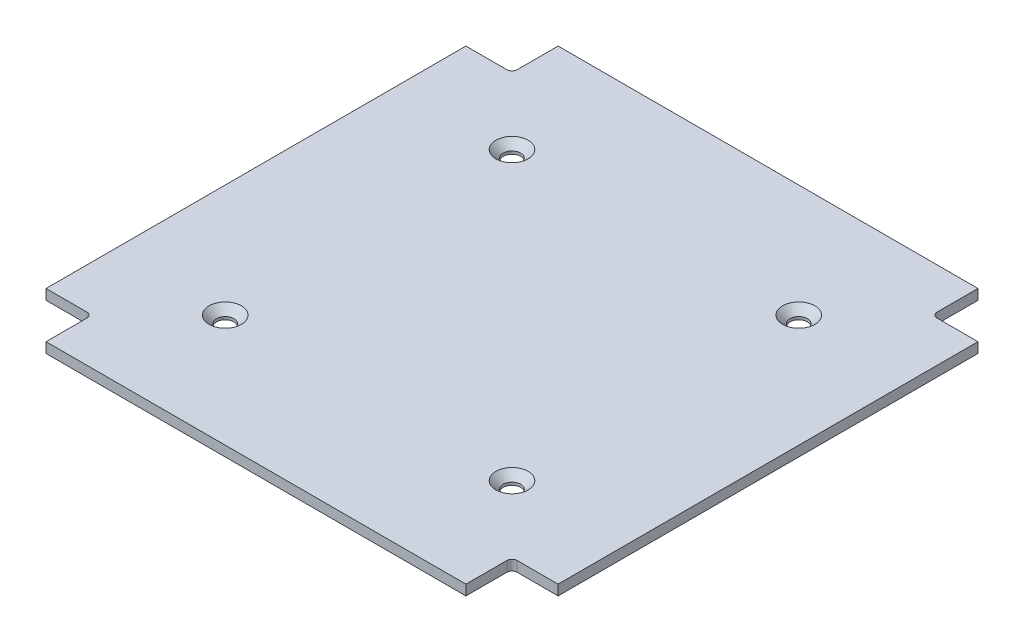
ISO-10303-21;
HEADER;
FILE_DESCRIPTION(('STEP AP214'),'2;1');
FILE_NAME('part.step','',(''),(''),'','','');
FILE_SCHEMA(('AUTOMOTIVE_DESIGN { 1 0 10303 214 1 1 1 1 }'));
ENDSEC;
DATA;
#1=APPLICATION_CONTEXT('core data for automotive mechanical design processes');
#2=APPLICATION_PROTOCOL_DEFINITION('international standard','automotive_design',2000,#1);
#3=PRODUCT_CONTEXT('',#1,'mechanical');
#4=PRODUCT('Part','Part','',(#3));
#5=PRODUCT_RELATED_PRODUCT_CATEGORY('part','',(#4));
#6=PRODUCT_DEFINITION_FORMATION('','',#4);
#7=PRODUCT_DEFINITION_CONTEXT('part definition',#1,'design');
#8=PRODUCT_DEFINITION('design','',#6,#7);
#9=PRODUCT_DEFINITION_SHAPE('','',#8);
#10=(LENGTH_UNIT() NAMED_UNIT(*) SI_UNIT(.MILLI.,.METRE.));
#11=(NAMED_UNIT(*) PLANE_ANGLE_UNIT() SI_UNIT($,.RADIAN.));
#12=(NAMED_UNIT(*) SI_UNIT($,.STERADIAN.) SOLID_ANGLE_UNIT());
#13=UNCERTAINTY_MEASURE_WITH_UNIT(LENGTH_MEASURE(1.E-05),#10,'distance_accuracy_value','');
#14=(GEOMETRIC_REPRESENTATION_CONTEXT(3) GLOBAL_UNCERTAINTY_ASSIGNED_CONTEXT((#13)) GLOBAL_UNIT_ASSIGNED_CONTEXT((#10,
#11,#12)) REPRESENTATION_CONTEXT('',''));
#15=CARTESIAN_POINT('',(0.,0.,0.));
#16=DIRECTION('',(0.,0.,1.));
#17=DIRECTION('',(1.,0.,0.));
#18=AXIS2_PLACEMENT_3D('',#15,#16,#17);
#19=CARTESIAN_POINT('',(50.,2.,50.));
#20=DIRECTION('',(-1.,0.,0.));
#21=DIRECTION('',(0.,0.,1.));
#22=AXIS2_PLACEMENT_3D('',#19,#20,#21);
#23=PLANE('',#22);
#24=DIRECTION('',(0.,0.,-1.));
#25=VECTOR('',#24,1.);
#26=CARTESIAN_POINT('',(50.,2.,50.));
#27=LINE('',#26,#25);
#28=CARTESIAN_POINT('',(50.,2.,41.));
#29=VERTEX_POINT('',#28);
#30=CARTESIAN_POINT('',(50.,2.,-41.));
#31=VERTEX_POINT('',#30);
#32=EDGE_CURVE('E159',#29,#31,#27,.T.);
#33=ORIENTED_EDGE('',*,*,#32,.F.);
#34=DIRECTION('',(0.,1.,0.));
#35=VECTOR('',#34,1.);
#36=CARTESIAN_POINT('',(50.,0.,41.));
#37=LINE('',#36,#35);
#38=CARTESIAN_POINT('',(50.,0.,41.));
#39=VERTEX_POINT('',#38);
#40=EDGE_CURVE('E145',#39,#29,#37,.T.);
#41=ORIENTED_EDGE('',*,*,#40,.F.);
#42=DIRECTION('',(0.,0.,-1.));
#43=VECTOR('',#42,1.);
#44=CARTESIAN_POINT('',(50.,0.,50.));
#45=LINE('',#44,#43);
#46=CARTESIAN_POINT('',(50.,0.,-41.));
#47=VERTEX_POINT('',#46);
#48=EDGE_CURVE('E156',#39,#47,#45,.T.);
#49=ORIENTED_EDGE('',*,*,#48,.T.);
#50=DIRECTION('',(0.,1.,0.));
#51=VECTOR('',#50,1.);
#52=CARTESIAN_POINT('',(50.,0.,-41.));
#53=LINE('',#52,#51);
#54=EDGE_CURVE('E166',#47,#31,#53,.T.);
#55=ORIENTED_EDGE('',*,*,#54,.T.);
#56=EDGE_LOOP('',(#33,#41,#49,#55));
#57=FACE_BOUND('',#56,.T.);
#58=ADVANCED_FACE('F33',(#57),#23,.F.);
#59=CARTESIAN_POINT('',(-50.,2.,-50.));
#60=DIRECTION('',(0.,0.,1.));
#61=DIRECTION('',(1.,0.,0.));
#62=AXIS2_PLACEMENT_3D('',#59,#60,#61);
#63=PLANE('',#62);
#64=DIRECTION('',(-1.,0.,0.));
#65=VECTOR('',#64,1.);
#66=CARTESIAN_POINT('',(-50.,0.,-50.));
#67=LINE('',#66,#65);
#68=CARTESIAN_POINT('',(41.,0.,-50.));
#69=VERTEX_POINT('',#68);
#70=CARTESIAN_POINT('',(-41.,0.,-50.));
#71=VERTEX_POINT('',#70);
#72=EDGE_CURVE('E165',#69,#71,#67,.T.);
#73=ORIENTED_EDGE('',*,*,#72,.T.);
#74=DIRECTION('',(0.,1.,0.));
#75=VECTOR('',#74,1.);
#76=CARTESIAN_POINT('',(-41.,0.,-50.));
#77=LINE('',#76,#75);
#78=CARTESIAN_POINT('',(-41.,2.,-50.));
#79=VERTEX_POINT('',#78);
#80=EDGE_CURVE('E261',#71,#79,#77,.T.);
#81=ORIENTED_EDGE('',*,*,#80,.T.);
#82=DIRECTION('',(-1.,0.,0.));
#83=VECTOR('',#82,1.);
#84=CARTESIAN_POINT('',(-50.,2.,-50.));
#85=LINE('',#84,#83);
#86=CARTESIAN_POINT('',(41.,2.,-50.));
#87=VERTEX_POINT('',#86);
#88=EDGE_CURVE('E276',#87,#79,#85,.T.);
#89=ORIENTED_EDGE('',*,*,#88,.F.);
#90=DIRECTION('',(0.,1.,0.));
#91=VECTOR('',#90,1.);
#92=CARTESIAN_POINT('',(41.,0.,-50.));
#93=LINE('',#92,#91);
#94=EDGE_CURVE('E171',#69,#87,#93,.T.);
#95=ORIENTED_EDGE('',*,*,#94,.F.);
#96=EDGE_LOOP('',(#73,#81,#89,#95));
#97=FACE_BOUND('',#96,.T.);
#98=ADVANCED_FACE('F358',(#97),#63,.F.);
#99=CARTESIAN_POINT('',(-50.,2.,50.));
#100=DIRECTION('',(1.,0.,0.));
#101=DIRECTION('',(0.,0.,-1.));
#102=AXIS2_PLACEMENT_3D('',#99,#100,#101);
#103=PLANE('',#102);
#104=DIRECTION('',(0.,0.,1.));
#105=VECTOR('',#104,1.);
#106=CARTESIAN_POINT('',(-50.,0.,50.));
#107=LINE('',#106,#105);
#108=CARTESIAN_POINT('',(-50.,0.,-41.));
#109=VERTEX_POINT('',#108);
#110=CARTESIAN_POINT('',(-50.,0.,41.));
#111=VERTEX_POINT('',#110);
#112=EDGE_CURVE('E169',#109,#111,#107,.T.);
#113=ORIENTED_EDGE('',*,*,#112,.T.);
#114=DIRECTION('',(0.,1.,0.));
#115=VECTOR('',#114,1.);
#116=CARTESIAN_POINT('',(-50.,0.,41.));
#117=LINE('',#116,#115);
#118=CARTESIAN_POINT('',(-50.,2.,41.));
#119=VERTEX_POINT('',#118);
#120=EDGE_CURVE('E227',#111,#119,#117,.T.);
#121=ORIENTED_EDGE('',*,*,#120,.T.);
#122=DIRECTION('',(0.,0.,1.));
#123=VECTOR('',#122,1.);
#124=CARTESIAN_POINT('',(-50.,2.,50.));
#125=LINE('',#124,#123);
#126=CARTESIAN_POINT('',(-50.,2.,-41.));
#127=VERTEX_POINT('',#126);
#128=EDGE_CURVE('E278',#127,#119,#125,.T.);
#129=ORIENTED_EDGE('',*,*,#128,.F.);
#130=DIRECTION('',(0.,1.,0.));
#131=VECTOR('',#130,1.);
#132=CARTESIAN_POINT('',(-50.,0.,-41.));
#133=LINE('',#132,#131);
#134=EDGE_CURVE('E257',#109,#127,#133,.T.);
#135=ORIENTED_EDGE('',*,*,#134,.F.);
#136=EDGE_LOOP('',(#113,#121,#129,#135));
#137=FACE_BOUND('',#136,.T.);
#138=ADVANCED_FACE('F363',(#137),#103,.F.);
#139=CARTESIAN_POINT('',(-50.,2.,50.));
#140=DIRECTION('',(0.,0.,-1.));
#141=DIRECTION('',(-1.,0.,0.));
#142=AXIS2_PLACEMENT_3D('',#139,#140,#141);
#143=PLANE('',#142);
#144=DIRECTION('',(1.,0.,0.));
#145=VECTOR('',#144,1.);
#146=CARTESIAN_POINT('',(-50.,0.,50.));
#147=LINE('',#146,#145);
#148=CARTESIAN_POINT('',(-41.,0.,50.));
#149=VERTEX_POINT('',#148);
#150=CARTESIAN_POINT('',(41.,0.,50.));
#151=VERTEX_POINT('',#150);
#152=EDGE_CURVE('E179',#149,#151,#147,.T.);
#153=ORIENTED_EDGE('',*,*,#152,.T.);
#154=DIRECTION('',(0.,1.,0.));
#155=VECTOR('',#154,1.);
#156=CARTESIAN_POINT('',(41.,0.,50.));
#157=LINE('',#156,#155);
#158=CARTESIAN_POINT('',(41.,2.,50.));
#159=VERTEX_POINT('',#158);
#160=EDGE_CURVE('E160',#151,#159,#157,.T.);
#161=ORIENTED_EDGE('',*,*,#160,.T.);
#162=DIRECTION('',(1.,0.,0.));
#163=VECTOR('',#162,1.);
#164=CARTESIAN_POINT('',(-50.,2.,50.));
#165=LINE('',#164,#163);
#166=CARTESIAN_POINT('',(-41.,2.,50.));
#167=VERTEX_POINT('',#166);
#168=EDGE_CURVE('E174',#167,#159,#165,.T.);
#169=ORIENTED_EDGE('',*,*,#168,.F.);
#170=DIRECTION('',(0.,1.,0.));
#171=VECTOR('',#170,1.);
#172=CARTESIAN_POINT('',(-41.,0.,50.));
#173=LINE('',#172,#171);
#174=EDGE_CURVE('E228',#149,#167,#173,.T.);
#175=ORIENTED_EDGE('',*,*,#174,.F.);
#176=EDGE_LOOP('',(#153,#161,#169,#175));
#177=FACE_BOUND('',#176,.T.);
#178=ADVANCED_FACE('F282',(#177),#143,.F.);
#179=CARTESIAN_POINT('',(50.,2.,-50.));
#180=DIRECTION('',(0.,-1.,0.));
#181=DIRECTION('',(0.,0.,-1.));
#182=AXIS2_PLACEMENT_3D('',#179,#180,#181);
#183=PLANE('',#182);
#184=CARTESIAN_POINT('',(-28.,2.,28.));
#185=DIRECTION('',(0.,1.,0.));
#186=DIRECTION('',(0.,0.,1.));
#187=AXIS2_PLACEMENT_3D('',#184,#185,#186);
#188=CIRCLE('',#187,3.15);
#189=CARTESIAN_POINT('',(-28.,2.,31.15));
#190=VERTEX_POINT('',#189);
#191=EDGE_CURVE('E326',#190,#190,#188,.T.);
#192=ORIENTED_EDGE('',*,*,#191,.F.);
#193=EDGE_LOOP('',(#192));
#194=FACE_BOUND('',#193,.T.);
#195=CARTESIAN_POINT('',(-28.,2.,-28.));
#196=DIRECTION('',(0.,1.,0.));
#197=DIRECTION('',(0.,0.,1.));
#198=AXIS2_PLACEMENT_3D('',#195,#196,#197);
#199=CIRCLE('',#198,3.15);
#200=CARTESIAN_POINT('',(-28.,2.,-24.85));
#201=VERTEX_POINT('',#200);
#202=EDGE_CURVE('E317',#201,#201,#199,.T.);
#203=ORIENTED_EDGE('',*,*,#202,.F.);
#204=EDGE_LOOP('',(#203));
#205=FACE_BOUND('',#204,.T.);
#206=CARTESIAN_POINT('',(28.,2.,-28.));
#207=DIRECTION('',(0.,1.,0.));
#208=DIRECTION('',(0.,0.,1.));
#209=AXIS2_PLACEMENT_3D('',#206,#207,#208);
#210=CIRCLE('',#209,3.15);
#211=CARTESIAN_POINT('',(28.,2.,-24.85));
#212=VERTEX_POINT('',#211);
#213=EDGE_CURVE('E308',#212,#212,#210,.T.);
#214=ORIENTED_EDGE('',*,*,#213,.F.);
#215=EDGE_LOOP('',(#214));
#216=FACE_BOUND('',#215,.T.);
#217=CARTESIAN_POINT('',(28.,2.,28.));
#218=DIRECTION('',(0.,1.,0.));
#219=DIRECTION('',(0.,0.,1.));
#220=AXIS2_PLACEMENT_3D('',#217,#218,#219);
#221=CIRCLE('',#220,3.15);
#222=CARTESIAN_POINT('',(28.,2.,31.15));
#223=VERTEX_POINT('',#222);
#224=EDGE_CURVE('E299',#223,#223,#221,.T.);
#225=ORIENTED_EDGE('',*,*,#224,.F.);
#226=EDGE_LOOP('',(#225));
#227=FACE_BOUND('',#226,.T.);
#228=ORIENTED_EDGE('',*,*,#168,.T.);
#229=DIRECTION('',(0.,0.,1.));
#230=VECTOR('',#229,1.);
#231=CARTESIAN_POINT('',(41.,2.,41.));
#232=LINE('',#231,#230);
#233=CARTESIAN_POINT('',(41.,2.,42.));
#234=VERTEX_POINT('',#233);
#235=EDGE_CURVE('E150',#234,#159,#232,.T.);
#236=ORIENTED_EDGE('',*,*,#235,.F.);
#237=CARTESIAN_POINT('',(42.,2.,42.));
#238=DIRECTION('',(0.,-1.,0.));
#239=DIRECTION('',(0.,0.,-1.));
#240=AXIS2_PLACEMENT_3D('',#237,#238,#239);
#241=CIRCLE('',#240,1.);
#242=CARTESIAN_POINT('',(42.,2.,41.));
#243=VERTEX_POINT('',#242);
#244=EDGE_CURVE('E41',#234,#243,#241,.T.);
#245=ORIENTED_EDGE('',*,*,#244,.T.);
#246=DIRECTION('',(-1.,0.,0.));
#247=VECTOR('',#246,1.);
#248=CARTESIAN_POINT('',(50.,2.,41.));
#249=LINE('',#248,#247);
#250=EDGE_CURVE('E288',#29,#243,#249,.T.);
#251=ORIENTED_EDGE('',*,*,#250,.F.);
#252=ORIENTED_EDGE('',*,*,#32,.T.);
#253=DIRECTION('',(1.,0.,0.));
#254=VECTOR('',#253,1.);
#255=CARTESIAN_POINT('',(50.,2.,-41.));
#256=LINE('',#255,#254);
#257=CARTESIAN_POINT('',(42.,2.,-41.));
#258=VERTEX_POINT('',#257);
#259=EDGE_CURVE('E269',#258,#31,#256,.T.);
#260=ORIENTED_EDGE('',*,*,#259,.F.);
#261=CARTESIAN_POINT('',(42.,2.,-42.));
#262=DIRECTION('',(0.,-1.,0.));
#263=DIRECTION('',(0.,0.,-1.));
#264=AXIS2_PLACEMENT_3D('',#261,#262,#263);
#265=CIRCLE('',#264,1.);
#266=CARTESIAN_POINT('',(41.,2.,-42.));
#267=VERTEX_POINT('',#266);
#268=EDGE_CURVE('E205',#258,#267,#265,.T.);
#269=ORIENTED_EDGE('',*,*,#268,.T.);
#270=DIRECTION('',(0.,0.,1.));
#271=VECTOR('',#270,1.);
#272=CARTESIAN_POINT('',(41.,2.,-41.));
#273=LINE('',#272,#271);
#274=EDGE_CURVE('E264',#87,#267,#273,.T.);
#275=ORIENTED_EDGE('',*,*,#274,.F.);
#276=ORIENTED_EDGE('',*,*,#88,.T.);
#277=DIRECTION('',(0.,0.,-1.));
#278=VECTOR('',#277,1.);
#279=CARTESIAN_POINT('',(-41.,2.,-41.));
#280=LINE('',#279,#278);
#281=CARTESIAN_POINT('',(-41.,2.,-42.));
#282=VERTEX_POINT('',#281);
#283=EDGE_CURVE('E255',#282,#79,#280,.T.);
#284=ORIENTED_EDGE('',*,*,#283,.F.);
#285=CARTESIAN_POINT('',(-42.,2.,-42.));
#286=DIRECTION('',(0.,-1.,0.));
#287=DIRECTION('',(0.,0.,-1.));
#288=AXIS2_PLACEMENT_3D('',#285,#286,#287);
#289=CIRCLE('',#288,1.);
#290=CARTESIAN_POINT('',(-42.,2.,-41.));
#291=VERTEX_POINT('',#290);
#292=EDGE_CURVE('E201',#282,#291,#289,.T.);
#293=ORIENTED_EDGE('',*,*,#292,.T.);
#294=DIRECTION('',(1.,0.,0.));
#295=VECTOR('',#294,1.);
#296=CARTESIAN_POINT('',(-50.,2.,-41.));
#297=LINE('',#296,#295);
#298=EDGE_CURVE('E249',#127,#291,#297,.T.);
#299=ORIENTED_EDGE('',*,*,#298,.F.);
#300=ORIENTED_EDGE('',*,*,#128,.T.);
#301=DIRECTION('',(-1.,0.,0.));
#302=VECTOR('',#301,1.);
#303=CARTESIAN_POINT('',(-50.,2.,41.));
#304=LINE('',#303,#302);
#305=CARTESIAN_POINT('',(-42.,2.,41.));
#306=VERTEX_POINT('',#305);
#307=EDGE_CURVE('E238',#306,#119,#304,.T.);
#308=ORIENTED_EDGE('',*,*,#307,.F.);
#309=CARTESIAN_POINT('',(-42.,2.,42.));
#310=DIRECTION('',(0.,-1.,0.));
#311=DIRECTION('',(0.,0.,-1.));
#312=AXIS2_PLACEMENT_3D('',#309,#310,#311);
#313=CIRCLE('',#312,1.);
#314=CARTESIAN_POINT('',(-41.,2.,42.));
#315=VERTEX_POINT('',#314);
#316=EDGE_CURVE('E209',#306,#315,#313,.T.);
#317=ORIENTED_EDGE('',*,*,#316,.T.);
#318=DIRECTION('',(0.,0.,-1.));
#319=VECTOR('',#318,1.);
#320=CARTESIAN_POINT('',(-41.,2.,41.));
#321=LINE('',#320,#319);
#322=EDGE_CURVE('E235',#167,#315,#321,.T.);
#323=ORIENTED_EDGE('',*,*,#322,.F.);
#324=EDGE_LOOP('',(#228,#236,#245,#251,#252,#260,#269,#275,#276,#284,#293,#299,#300,#308,#317,#323));
#325=FACE_BOUND('',#324,.T.);
#326=ADVANCED_FACE('F234',(#194,#205,#216,#227,#325),#183,.F.);
#327=CARTESIAN_POINT('',(50.,0.,-50.));
#328=DIRECTION('',(0.,-1.,0.));
#329=DIRECTION('',(0.,0.,-1.));
#330=AXIS2_PLACEMENT_3D('',#327,#328,#329);
#331=PLANE('',#330);
#332=CARTESIAN_POINT('',(-28.,0.,28.));
#333=DIRECTION('',(0.,1.,0.));
#334=DIRECTION('',(0.,0.,1.));
#335=AXIS2_PLACEMENT_3D('',#332,#333,#334);
#336=CIRCLE('',#335,1.7);
#337=CARTESIAN_POINT('',(-28.,0.,29.7));
#338=VERTEX_POINT('',#337);
#339=EDGE_CURVE('E320',#338,#338,#336,.T.);
#340=ORIENTED_EDGE('',*,*,#339,.T.);
#341=EDGE_LOOP('',(#340));
#342=FACE_BOUND('',#341,.T.);
#343=CARTESIAN_POINT('',(-28.,0.,-28.));
#344=DIRECTION('',(0.,1.,0.));
#345=DIRECTION('',(0.,0.,1.));
#346=AXIS2_PLACEMENT_3D('',#343,#344,#345);
#347=CIRCLE('',#346,1.7);
#348=CARTESIAN_POINT('',(-28.,0.,-26.3));
#349=VERTEX_POINT('',#348);
#350=EDGE_CURVE('E311',#349,#349,#347,.T.);
#351=ORIENTED_EDGE('',*,*,#350,.T.);
#352=EDGE_LOOP('',(#351));
#353=FACE_BOUND('',#352,.T.);
#354=CARTESIAN_POINT('',(28.,0.,-28.));
#355=DIRECTION('',(0.,1.,0.));
#356=DIRECTION('',(0.,0.,1.));
#357=AXIS2_PLACEMENT_3D('',#354,#355,#356);
#358=CIRCLE('',#357,1.7);
#359=CARTESIAN_POINT('',(28.,0.,-26.3));
#360=VERTEX_POINT('',#359);
#361=EDGE_CURVE('E302',#360,#360,#358,.T.);
#362=ORIENTED_EDGE('',*,*,#361,.T.);
#363=EDGE_LOOP('',(#362));
#364=FACE_BOUND('',#363,.T.);
#365=CARTESIAN_POINT('',(28.,0.,28.));
#366=DIRECTION('',(0.,1.,0.));
#367=DIRECTION('',(0.,0.,1.));
#368=AXIS2_PLACEMENT_3D('',#365,#366,#367);
#369=CIRCLE('',#368,1.7);
#370=CARTESIAN_POINT('',(28.,0.,29.7));
#371=VERTEX_POINT('',#370);
#372=EDGE_CURVE('E290',#371,#371,#369,.T.);
#373=ORIENTED_EDGE('',*,*,#372,.T.);
#374=EDGE_LOOP('',(#373));
#375=FACE_BOUND('',#374,.T.);
#376=DIRECTION('',(-1.,0.,0.));
#377=VECTOR('',#376,1.);
#378=CARTESIAN_POINT('',(50.,0.,41.));
#379=LINE('',#378,#377);
#380=CARTESIAN_POINT('',(42.,0.,41.));
#381=VERTEX_POINT('',#380);
#382=EDGE_CURVE('E142',#39,#381,#379,.T.);
#383=ORIENTED_EDGE('',*,*,#382,.T.);
#384=CARTESIAN_POINT('',(42.,0.,42.));
#385=DIRECTION('',(0.,-1.,0.));
#386=DIRECTION('',(0.,0.,-1.));
#387=AXIS2_PLACEMENT_3D('',#384,#385,#386);
#388=CIRCLE('',#387,1.);
#389=CARTESIAN_POINT('',(41.,0.,42.));
#390=VERTEX_POINT('',#389);
#391=EDGE_CURVE('E11',#381,#390,#388,.F.);
#392=ORIENTED_EDGE('',*,*,#391,.T.);
#393=DIRECTION('',(0.,0.,1.));
#394=VECTOR('',#393,1.);
#395=CARTESIAN_POINT('',(41.,0.,41.));
#396=LINE('',#395,#394);
#397=EDGE_CURVE('E149',#390,#151,#396,.T.);
#398=ORIENTED_EDGE('',*,*,#397,.T.);
#399=ORIENTED_EDGE('',*,*,#152,.F.);
#400=DIRECTION('',(0.,0.,-1.));
#401=VECTOR('',#400,1.);
#402=CARTESIAN_POINT('',(-41.,0.,41.));
#403=LINE('',#402,#401);
#404=CARTESIAN_POINT('',(-41.,0.,42.));
#405=VERTEX_POINT('',#404);
#406=EDGE_CURVE('E219',#149,#405,#403,.T.);
#407=ORIENTED_EDGE('',*,*,#406,.T.);
#408=CARTESIAN_POINT('',(-42.,0.,42.));
#409=DIRECTION('',(0.,-1.,0.));
#410=DIRECTION('',(0.,0.,-1.));
#411=AXIS2_PLACEMENT_3D('',#408,#409,#410);
#412=CIRCLE('',#411,1.);
#413=CARTESIAN_POINT('',(-42.,0.,41.));
#414=VERTEX_POINT('',#413);
#415=EDGE_CURVE('E211',#405,#414,#412,.F.);
#416=ORIENTED_EDGE('',*,*,#415,.T.);
#417=DIRECTION('',(-1.,0.,0.));
#418=VECTOR('',#417,1.);
#419=CARTESIAN_POINT('',(-50.,0.,41.));
#420=LINE('',#419,#418);
#421=EDGE_CURVE('E216',#414,#111,#420,.T.);
#422=ORIENTED_EDGE('',*,*,#421,.T.);
#423=ORIENTED_EDGE('',*,*,#112,.F.);
#424=DIRECTION('',(1.,0.,0.));
#425=VECTOR('',#424,1.);
#426=CARTESIAN_POINT('',(-50.,0.,-41.));
#427=LINE('',#426,#425);
#428=CARTESIAN_POINT('',(-42.,0.,-41.));
#429=VERTEX_POINT('',#428);
#430=EDGE_CURVE('E251',#109,#429,#427,.T.);
#431=ORIENTED_EDGE('',*,*,#430,.T.);
#432=CARTESIAN_POINT('',(-42.,0.,-42.));
#433=DIRECTION('',(0.,-1.,0.));
#434=DIRECTION('',(0.,0.,-1.));
#435=AXIS2_PLACEMENT_3D('',#432,#433,#434);
#436=CIRCLE('',#435,1.);
#437=CARTESIAN_POINT('',(-41.,0.,-42.));
#438=VERTEX_POINT('',#437);
#439=EDGE_CURVE('E203',#429,#438,#436,.F.);
#440=ORIENTED_EDGE('',*,*,#439,.T.);
#441=DIRECTION('',(0.,0.,-1.));
#442=VECTOR('',#441,1.);
#443=CARTESIAN_POINT('',(-41.,0.,-41.));
#444=LINE('',#443,#442);
#445=EDGE_CURVE('E254',#438,#71,#444,.T.);
#446=ORIENTED_EDGE('',*,*,#445,.T.);
#447=ORIENTED_EDGE('',*,*,#72,.F.);
#448=DIRECTION('',(0.,0.,1.));
#449=VECTOR('',#448,1.);
#450=CARTESIAN_POINT('',(41.,0.,-41.));
#451=LINE('',#450,#449);
#452=CARTESIAN_POINT('',(41.,0.,-42.));
#453=VERTEX_POINT('',#452);
#454=EDGE_CURVE('E266',#69,#453,#451,.T.);
#455=ORIENTED_EDGE('',*,*,#454,.T.);
#456=CARTESIAN_POINT('',(42.,0.,-42.));
#457=DIRECTION('',(0.,-1.,0.));
#458=DIRECTION('',(0.,0.,-1.));
#459=AXIS2_PLACEMENT_3D('',#456,#457,#458);
#460=CIRCLE('',#459,1.);
#461=CARTESIAN_POINT('',(42.,0.,-41.));
#462=VERTEX_POINT('',#461);
#463=EDGE_CURVE('E207',#453,#462,#460,.F.);
#464=ORIENTED_EDGE('',*,*,#463,.T.);
#465=DIRECTION('',(1.,0.,0.));
#466=VECTOR('',#465,1.);
#467=CARTESIAN_POINT('',(50.,0.,-41.));
#468=LINE('',#467,#466);
#469=EDGE_CURVE('E164',#462,#47,#468,.T.);
#470=ORIENTED_EDGE('',*,*,#469,.T.);
#471=ORIENTED_EDGE('',*,*,#48,.F.);
#472=EDGE_LOOP('',(#383,#392,#398,#399,#407,#416,#422,#423,#431,#440,#446,#447,#455,#464,#470,#471));
#473=FACE_BOUND('',#472,.T.);
#474=ADVANCED_FACE('F162',(#342,#353,#364,#375,#473),#331,.T.);
#475=CARTESIAN_POINT('',(50.,0.,-41.));
#476=DIRECTION('',(0.,0.,1.));
#477=DIRECTION('',(1.,0.,0.));
#478=AXIS2_PLACEMENT_3D('',#475,#476,#477);
#479=PLANE('',#478);
#480=ORIENTED_EDGE('',*,*,#469,.F.);
#481=DIRECTION('',(0.,1.,0.));
#482=VECTOR('',#481,1.);
#483=CARTESIAN_POINT('',(42.,2.,-41.));
#484=LINE('',#483,#482);
#485=EDGE_CURVE('E187',#462,#258,#484,.T.);
#486=ORIENTED_EDGE('',*,*,#485,.T.);
#487=ORIENTED_EDGE('',*,*,#259,.T.);
#488=ORIENTED_EDGE('',*,*,#54,.F.);
#489=EDGE_LOOP('',(#480,#486,#487,#488));
#490=FACE_BOUND('',#489,.T.);
#491=ADVANCED_FACE('F463',(#490),#479,.F.);
#492=CARTESIAN_POINT('',(41.,0.,-41.));
#493=DIRECTION('',(-1.,0.,0.));
#494=DIRECTION('',(0.,0.,1.));
#495=AXIS2_PLACEMENT_3D('',#492,#493,#494);
#496=PLANE('',#495);
#497=ORIENTED_EDGE('',*,*,#274,.T.);
#498=DIRECTION('',(0.,1.,0.));
#499=VECTOR('',#498,1.);
#500=CARTESIAN_POINT('',(41.,0.,-42.));
#501=LINE('',#500,#499);
#502=EDGE_CURVE('E190',#267,#453,#501,.F.);
#503=ORIENTED_EDGE('',*,*,#502,.T.);
#504=ORIENTED_EDGE('',*,*,#454,.F.);
#505=ORIENTED_EDGE('',*,*,#94,.T.);
#506=EDGE_LOOP('',(#497,#503,#504,#505));
#507=FACE_BOUND('',#506,.T.);
#508=ADVANCED_FACE('F453',(#507),#496,.F.);
#509=CARTESIAN_POINT('',(-41.,0.,-41.));
#510=DIRECTION('',(1.,0.,0.));
#511=DIRECTION('',(0.,0.,-1.));
#512=AXIS2_PLACEMENT_3D('',#509,#510,#511);
#513=PLANE('',#512);
#514=ORIENTED_EDGE('',*,*,#445,.F.);
#515=DIRECTION('',(0.,1.,0.));
#516=VECTOR('',#515,1.);
#517=CARTESIAN_POINT('',(-41.,2.,-42.));
#518=LINE('',#517,#516);
#519=EDGE_CURVE('E182',#438,#282,#518,.T.);
#520=ORIENTED_EDGE('',*,*,#519,.T.);
#521=ORIENTED_EDGE('',*,*,#283,.T.);
#522=ORIENTED_EDGE('',*,*,#80,.F.);
#523=EDGE_LOOP('',(#514,#520,#521,#522));
#524=FACE_BOUND('',#523,.T.);
#525=ADVANCED_FACE('F443',(#524),#513,.F.);
#526=CARTESIAN_POINT('',(-50.,0.,-41.));
#527=DIRECTION('',(0.,0.,1.));
#528=DIRECTION('',(1.,0.,0.));
#529=AXIS2_PLACEMENT_3D('',#526,#527,#528);
#530=PLANE('',#529);
#531=ORIENTED_EDGE('',*,*,#298,.T.);
#532=DIRECTION('',(0.,1.,0.));
#533=VECTOR('',#532,1.);
#534=CARTESIAN_POINT('',(-42.,0.,-41.));
#535=LINE('',#534,#533);
#536=EDGE_CURVE('E185',#291,#429,#535,.F.);
#537=ORIENTED_EDGE('',*,*,#536,.T.);
#538=ORIENTED_EDGE('',*,*,#430,.F.);
#539=ORIENTED_EDGE('',*,*,#134,.T.);
#540=EDGE_LOOP('',(#531,#537,#538,#539));
#541=FACE_BOUND('',#540,.T.);
#542=ADVANCED_FACE('F434',(#541),#530,.F.);
#543=CARTESIAN_POINT('',(-50.,0.,41.));
#544=DIRECTION('',(0.,0.,-1.));
#545=DIRECTION('',(-1.,0.,0.));
#546=AXIS2_PLACEMENT_3D('',#543,#544,#545);
#547=PLANE('',#546);
#548=ORIENTED_EDGE('',*,*,#421,.F.);
#549=DIRECTION('',(0.,1.,0.));
#550=VECTOR('',#549,1.);
#551=CARTESIAN_POINT('',(-42.,2.,41.));
#552=LINE('',#551,#550);
#553=EDGE_CURVE('E192',#414,#306,#552,.T.);
#554=ORIENTED_EDGE('',*,*,#553,.T.);
#555=ORIENTED_EDGE('',*,*,#307,.T.);
#556=ORIENTED_EDGE('',*,*,#120,.F.);
#557=EDGE_LOOP('',(#548,#554,#555,#556));
#558=FACE_BOUND('',#557,.T.);
#559=ADVANCED_FACE('F224',(#558),#547,.F.);
#560=CARTESIAN_POINT('',(-41.,0.,41.));
#561=DIRECTION('',(1.,0.,0.));
#562=DIRECTION('',(0.,0.,-1.));
#563=AXIS2_PLACEMENT_3D('',#560,#561,#562);
#564=PLANE('',#563);
#565=ORIENTED_EDGE('',*,*,#322,.T.);
#566=DIRECTION('',(0.,1.,0.));
#567=VECTOR('',#566,1.);
#568=CARTESIAN_POINT('',(-41.,0.,42.));
#569=LINE('',#568,#567);
#570=EDGE_CURVE('E195',#315,#405,#569,.F.);
#571=ORIENTED_EDGE('',*,*,#570,.T.);
#572=ORIENTED_EDGE('',*,*,#406,.F.);
#573=ORIENTED_EDGE('',*,*,#174,.T.);
#574=EDGE_LOOP('',(#565,#571,#572,#573));
#575=FACE_BOUND('',#574,.T.);
#576=ADVANCED_FACE('F240',(#575),#564,.F.);
#577=CARTESIAN_POINT('',(41.,0.,41.));
#578=DIRECTION('',(-1.,0.,0.));
#579=DIRECTION('',(0.,0.,1.));
#580=AXIS2_PLACEMENT_3D('',#577,#578,#579);
#581=PLANE('',#580);
#582=ORIENTED_EDGE('',*,*,#397,.F.);
#583=DIRECTION('',(0.,1.,0.));
#584=VECTOR('',#583,1.);
#585=CARTESIAN_POINT('',(41.,2.,42.));
#586=LINE('',#585,#584);
#587=EDGE_CURVE('E197',#390,#234,#586,.T.);
#588=ORIENTED_EDGE('',*,*,#587,.T.);
#589=ORIENTED_EDGE('',*,*,#235,.T.);
#590=ORIENTED_EDGE('',*,*,#160,.F.);
#591=EDGE_LOOP('',(#582,#588,#589,#590));
#592=FACE_BOUND('',#591,.T.);
#593=ADVANCED_FACE('F286',(#592),#581,.F.);
#594=CARTESIAN_POINT('',(50.,0.,41.));
#595=DIRECTION('',(0.,0.,-1.));
#596=DIRECTION('',(-1.,0.,0.));
#597=AXIS2_PLACEMENT_3D('',#594,#595,#596);
#598=PLANE('',#597);
#599=ORIENTED_EDGE('',*,*,#250,.T.);
#600=DIRECTION('',(0.,1.,0.));
#601=VECTOR('',#600,1.);
#602=CARTESIAN_POINT('',(42.,0.,41.));
#603=LINE('',#602,#601);
#604=EDGE_CURVE('E48',#243,#381,#603,.F.);
#605=ORIENTED_EDGE('',*,*,#604,.T.);
#606=ORIENTED_EDGE('',*,*,#382,.F.);
#607=ORIENTED_EDGE('',*,*,#40,.T.);
#608=EDGE_LOOP('',(#599,#605,#606,#607));
#609=FACE_BOUND('',#608,.T.);
#610=ADVANCED_FACE('F144',(#609),#598,.F.);
#611=CARTESIAN_POINT('',(28.,2.,28.));
#612=DIRECTION('',(0.,1.,0.));
#613=DIRECTION('',(0.,0.,1.));
#614=AXIS2_PLACEMENT_3D('',#611,#612,#613);
#615=CYLINDRICAL_SURFACE('',#614,1.7);
#616=ORIENTED_EDGE('',*,*,#372,.F.);
#617=EDGE_LOOP('',(#616));
#618=FACE_BOUND('',#617,.T.);
#619=CARTESIAN_POINT('',(28.,0.549999999999998,28.));
#620=DIRECTION('',(0.,1.,0.));
#621=DIRECTION('',(0.,0.,1.));
#622=AXIS2_PLACEMENT_3D('',#619,#620,#621);
#623=CIRCLE('',#622,1.7);
#624=CARTESIAN_POINT('',(28.,0.549999999999998,29.7));
#625=VERTEX_POINT('',#624);
#626=EDGE_CURVE('E296',#625,#625,#623,.T.);
#627=ORIENTED_EDGE('',*,*,#626,.T.);
#628=EDGE_LOOP('',(#627));
#629=FACE_BOUND('',#628,.T.);
#630=ADVANCED_FACE('F344',(#618,#629),#615,.F.);
#631=CARTESIAN_POINT('',(28.,2.,28.));
#632=DIRECTION('',(0.,1.,0.));
#633=DIRECTION('',(0.,0.,1.));
#634=AXIS2_PLACEMENT_3D('',#631,#632,#633);
#635=CONICAL_SURFACE('',#634,3.15,0.785398163397447);
#636=ORIENTED_EDGE('',*,*,#626,.F.);
#637=EDGE_LOOP('',(#636));
#638=FACE_BOUND('',#637,.T.);
#639=ORIENTED_EDGE('',*,*,#224,.T.);
#640=EDGE_LOOP('',(#639));
#641=FACE_BOUND('',#640,.T.);
#642=ADVANCED_FACE('F341',(#638,#641),#635,.F.);
#643=CARTESIAN_POINT('',(28.,2.,-28.));
#644=DIRECTION('',(0.,1.,0.));
#645=DIRECTION('',(0.,0.,1.));
#646=AXIS2_PLACEMENT_3D('',#643,#644,#645);
#647=CYLINDRICAL_SURFACE('',#646,1.7);
#648=ORIENTED_EDGE('',*,*,#361,.F.);
#649=EDGE_LOOP('',(#648));
#650=FACE_BOUND('',#649,.T.);
#651=CARTESIAN_POINT('',(28.,0.549999999999998,-28.));
#652=DIRECTION('',(0.,1.,0.));
#653=DIRECTION('',(0.,0.,1.));
#654=AXIS2_PLACEMENT_3D('',#651,#652,#653);
#655=CIRCLE('',#654,1.7);
#656=CARTESIAN_POINT('',(28.,0.549999999999998,-26.3));
#657=VERTEX_POINT('',#656);
#658=EDGE_CURVE('E305',#657,#657,#655,.T.);
#659=ORIENTED_EDGE('',*,*,#658,.T.);
#660=EDGE_LOOP('',(#659));
#661=FACE_BOUND('',#660,.T.);
#662=ADVANCED_FACE('F343',(#650,#661),#647,.F.);
#663=CARTESIAN_POINT('',(28.,2.,-28.));
#664=DIRECTION('',(0.,1.,0.));
#665=DIRECTION('',(0.,0.,1.));
#666=AXIS2_PLACEMENT_3D('',#663,#664,#665);
#667=CONICAL_SURFACE('',#666,3.15,0.785398163397447);
#668=ORIENTED_EDGE('',*,*,#658,.F.);
#669=EDGE_LOOP('',(#668));
#670=FACE_BOUND('',#669,.T.);
#671=ORIENTED_EDGE('',*,*,#213,.T.);
#672=EDGE_LOOP('',(#671));
#673=FACE_BOUND('',#672,.T.);
#674=ADVANCED_FACE('F351',(#670,#673),#667,.F.);
#675=CARTESIAN_POINT('',(-28.,2.,-28.));
#676=DIRECTION('',(0.,1.,0.));
#677=DIRECTION('',(0.,0.,1.));
#678=AXIS2_PLACEMENT_3D('',#675,#676,#677);
#679=CYLINDRICAL_SURFACE('',#678,1.7);
#680=ORIENTED_EDGE('',*,*,#350,.F.);
#681=EDGE_LOOP('',(#680));
#682=FACE_BOUND('',#681,.T.);
#683=CARTESIAN_POINT('',(-28.,0.549999999999998,-28.));
#684=DIRECTION('',(0.,1.,0.));
#685=DIRECTION('',(0.,0.,1.));
#686=AXIS2_PLACEMENT_3D('',#683,#684,#685);
#687=CIRCLE('',#686,1.7);
#688=CARTESIAN_POINT('',(-28.,0.549999999999998,-26.3));
#689=VERTEX_POINT('',#688);
#690=EDGE_CURVE('E314',#689,#689,#687,.T.);
#691=ORIENTED_EDGE('',*,*,#690,.T.);
#692=EDGE_LOOP('',(#691));
#693=FACE_BOUND('',#692,.T.);
#694=ADVANCED_FACE('F517',(#682,#693),#679,.F.);
#695=CARTESIAN_POINT('',(-28.,2.,-28.));
#696=DIRECTION('',(0.,1.,0.));
#697=DIRECTION('',(0.,0.,1.));
#698=AXIS2_PLACEMENT_3D('',#695,#696,#697);
#699=CONICAL_SURFACE('',#698,3.15,0.785398163397447);
#700=ORIENTED_EDGE('',*,*,#690,.F.);
#701=EDGE_LOOP('',(#700));
#702=FACE_BOUND('',#701,.T.);
#703=ORIENTED_EDGE('',*,*,#202,.T.);
#704=EDGE_LOOP('',(#703));
#705=FACE_BOUND('',#704,.T.);
#706=ADVANCED_FACE('F507',(#702,#705),#699,.F.);
#707=CARTESIAN_POINT('',(-28.,2.,28.));
#708=DIRECTION('',(0.,1.,0.));
#709=DIRECTION('',(0.,0.,1.));
#710=AXIS2_PLACEMENT_3D('',#707,#708,#709);
#711=CYLINDRICAL_SURFACE('',#710,1.7);
#712=ORIENTED_EDGE('',*,*,#339,.F.);
#713=EDGE_LOOP('',(#712));
#714=FACE_BOUND('',#713,.T.);
#715=CARTESIAN_POINT('',(-28.,0.549999999999998,28.));
#716=DIRECTION('',(0.,1.,0.));
#717=DIRECTION('',(0.,0.,1.));
#718=AXIS2_PLACEMENT_3D('',#715,#716,#717);
#719=CIRCLE('',#718,1.7);
#720=CARTESIAN_POINT('',(-28.,0.549999999999998,29.7));
#721=VERTEX_POINT('',#720);
#722=EDGE_CURVE('E323',#721,#721,#719,.T.);
#723=ORIENTED_EDGE('',*,*,#722,.T.);
#724=EDGE_LOOP('',(#723));
#725=FACE_BOUND('',#724,.T.);
#726=ADVANCED_FACE('F497',(#714,#725),#711,.F.);
#727=CARTESIAN_POINT('',(-28.,2.,28.));
#728=DIRECTION('',(0.,1.,0.));
#729=DIRECTION('',(0.,0.,1.));
#730=AXIS2_PLACEMENT_3D('',#727,#728,#729);
#731=CONICAL_SURFACE('',#730,3.15,0.785398163397447);
#732=ORIENTED_EDGE('',*,*,#722,.F.);
#733=EDGE_LOOP('',(#732));
#734=FACE_BOUND('',#733,.T.);
#735=ORIENTED_EDGE('',*,*,#191,.T.);
#736=EDGE_LOOP('',(#735));
#737=FACE_BOUND('',#736,.T.);
#738=ADVANCED_FACE('F330',(#734,#737),#731,.F.);
#739=CARTESIAN_POINT('',(-42.,0.,-42.));
#740=DIRECTION('',(0.,-1.,0.));
#741=DIRECTION('',(0.,0.,-1.));
#742=AXIS2_PLACEMENT_3D('',#739,#740,#741);
#743=CYLINDRICAL_SURFACE('',#742,1.);
#744=ORIENTED_EDGE('',*,*,#439,.F.);
#745=ORIENTED_EDGE('',*,*,#536,.F.);
#746=ORIENTED_EDGE('',*,*,#292,.F.);
#747=ORIENTED_EDGE('',*,*,#519,.F.);
#748=EDGE_LOOP('',(#744,#745,#746,#747));
#749=FACE_BOUND('',#748,.T.);
#750=ADVANCED_FACE('F368',(#749),#743,.F.);
#751=CARTESIAN_POINT('',(42.,0.,-42.));
#752=DIRECTION('',(0.,-1.,0.));
#753=DIRECTION('',(0.,0.,-1.));
#754=AXIS2_PLACEMENT_3D('',#751,#752,#753);
#755=CYLINDRICAL_SURFACE('',#754,1.);
#756=ORIENTED_EDGE('',*,*,#463,.F.);
#757=ORIENTED_EDGE('',*,*,#502,.F.);
#758=ORIENTED_EDGE('',*,*,#268,.F.);
#759=ORIENTED_EDGE('',*,*,#485,.F.);
#760=EDGE_LOOP('',(#756,#757,#758,#759));
#761=FACE_BOUND('',#760,.T.);
#762=ADVANCED_FACE('F371',(#761),#755,.F.);
#763=CARTESIAN_POINT('',(-42.,0.,42.));
#764=DIRECTION('',(0.,-1.,0.));
#765=DIRECTION('',(0.,0.,-1.));
#766=AXIS2_PLACEMENT_3D('',#763,#764,#765);
#767=CYLINDRICAL_SURFACE('',#766,1.);
#768=ORIENTED_EDGE('',*,*,#415,.F.);
#769=ORIENTED_EDGE('',*,*,#570,.F.);
#770=ORIENTED_EDGE('',*,*,#316,.F.);
#771=ORIENTED_EDGE('',*,*,#553,.F.);
#772=EDGE_LOOP('',(#768,#769,#770,#771));
#773=FACE_BOUND('',#772,.T.);
#774=ADVANCED_FACE('F230',(#773),#767,.F.);
#775=CARTESIAN_POINT('',(42.,0.,42.));
#776=DIRECTION('',(0.,-1.,0.));
#777=DIRECTION('',(0.,0.,-1.));
#778=AXIS2_PLACEMENT_3D('',#775,#776,#777);
#779=CYLINDRICAL_SURFACE('',#778,1.);
#780=ORIENTED_EDGE('',*,*,#391,.F.);
#781=ORIENTED_EDGE('',*,*,#604,.F.);
#782=ORIENTED_EDGE('',*,*,#244,.F.);
#783=ORIENTED_EDGE('',*,*,#587,.F.);
#784=EDGE_LOOP('',(#780,#781,#782,#783));
#785=FACE_BOUND('',#784,.T.);
#786=ADVANCED_FACE('F35',(#785),#779,.F.);
#787=CLOSED_SHELL('',(#58,#98,#138,#178,#326,#474,#491,#508,#525,#542,#559,#576,#593,#610,#630,
#642,#662,#674,#694,#706,#726,#738,#750,#762,#774,#786));
#788=MANIFOLD_SOLID_BREP('B2',#787);
#789=ADVANCED_BREP_SHAPE_REPRESENTATION('',(#18,#788),#14);
#790=SHAPE_DEFINITION_REPRESENTATION(#9,#789);
ENDSEC;
END-ISO-10303-21;
